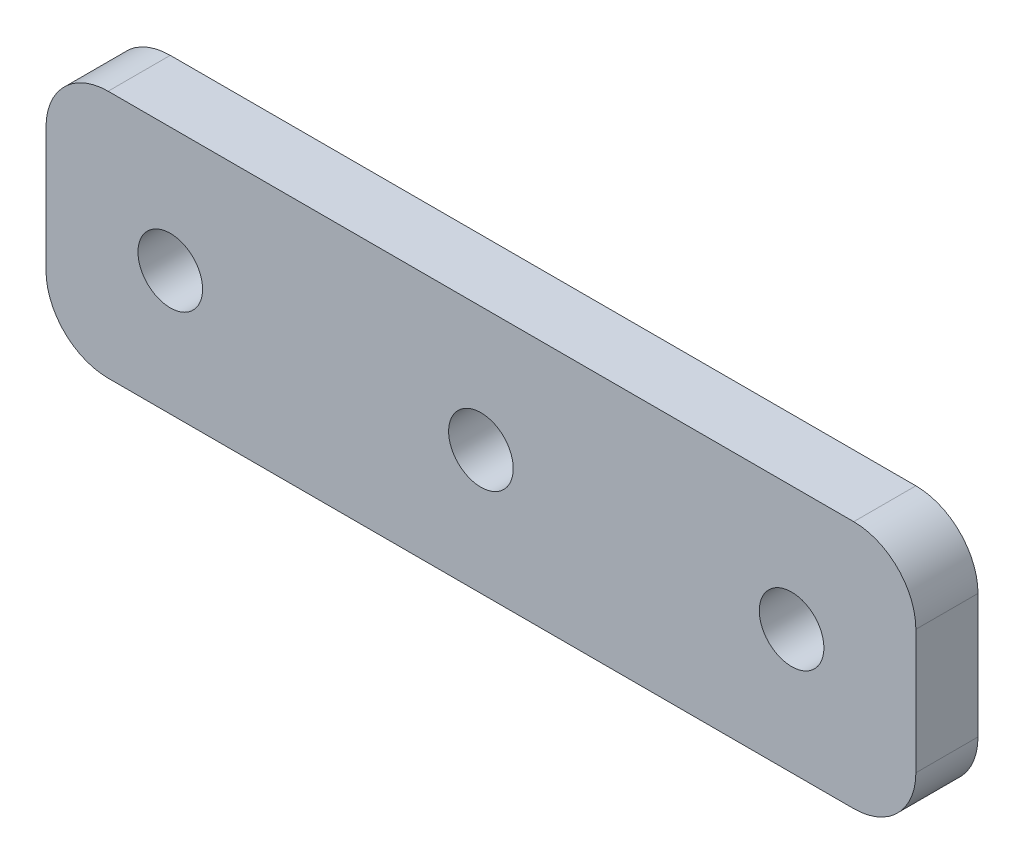
ISO-10303-21;
HEADER;
FILE_DESCRIPTION(('STEP AP214'),'2;1');
FILE_NAME('part.step','',(''),(''),'','','');
FILE_SCHEMA(('AUTOMOTIVE_DESIGN { 1 0 10303 214 1 1 1 1 }'));
ENDSEC;
DATA;
#1=APPLICATION_CONTEXT('core data for automotive mechanical design processes');
#2=APPLICATION_PROTOCOL_DEFINITION('international standard','automotive_design',2000,#1);
#3=PRODUCT_CONTEXT('',#1,'mechanical');
#4=PRODUCT('Part','Part','',(#3));
#5=PRODUCT_RELATED_PRODUCT_CATEGORY('part','',(#4));
#6=PRODUCT_DEFINITION_FORMATION('','',#4);
#7=PRODUCT_DEFINITION_CONTEXT('part definition',#1,'design');
#8=PRODUCT_DEFINITION('design','',#6,#7);
#9=PRODUCT_DEFINITION_SHAPE('','',#8);
#10=(LENGTH_UNIT() NAMED_UNIT(*) SI_UNIT(.MILLI.,.METRE.));
#11=(NAMED_UNIT(*) PLANE_ANGLE_UNIT() SI_UNIT($,.RADIAN.));
#12=(NAMED_UNIT(*) SI_UNIT($,.STERADIAN.) SOLID_ANGLE_UNIT());
#13=UNCERTAINTY_MEASURE_WITH_UNIT(LENGTH_MEASURE(1.E-05),#10,'distance_accuracy_value','');
#14=(GEOMETRIC_REPRESENTATION_CONTEXT(3) GLOBAL_UNCERTAINTY_ASSIGNED_CONTEXT((#13)) GLOBAL_UNIT_ASSIGNED_CONTEXT((#10,
#11,#12)) REPRESENTATION_CONTEXT('',''));
#15=CARTESIAN_POINT('',(0.,0.,0.));
#16=DIRECTION('',(0.,0.,1.));
#17=DIRECTION('',(1.,0.,0.));
#18=AXIS2_PLACEMENT_3D('',#15,#16,#17);
#19=CARTESIAN_POINT('',(0.,0.,5.));
#20=DIRECTION('',(0.,0.,1.));
#21=DIRECTION('',(1.,0.,0.));
#22=AXIS2_PLACEMENT_3D('',#19,#20,#21);
#23=PLANE('',#22);
#24=CARTESIAN_POINT('',(50.,0.,5.));
#25=DIRECTION('',(0.,0.,1.));
#26=DIRECTION('',(1.,0.,0.));
#27=AXIS2_PLACEMENT_3D('',#24,#25,#26);
#28=CIRCLE('',#27,2.6);
#29=CARTESIAN_POINT('',(52.6,0.,5.));
#30=VERTEX_POINT('',#29);
#31=EDGE_CURVE('E217',#30,#30,#28,.T.);
#32=ORIENTED_EDGE('',*,*,#31,.F.);
#33=EDGE_LOOP('',(#32));
#34=FACE_BOUND('',#33,.T.);
#35=DIRECTION('',(0.,-1.,0.));
#36=VECTOR('',#35,1.);
#37=CARTESIAN_POINT('',(-10.,-10.,5.));
#38=LINE('',#37,#36);
#39=CARTESIAN_POINT('',(-10.,5.,5.));
#40=VERTEX_POINT('',#39);
#41=CARTESIAN_POINT('',(-10.,-5.,5.));
#42=VERTEX_POINT('',#41);
#43=EDGE_CURVE('E156',#40,#42,#38,.T.);
#44=ORIENTED_EDGE('',*,*,#43,.T.);
#45=CARTESIAN_POINT('',(-5.,-5.,5.));
#46=DIRECTION('',(0.,0.,1.));
#47=DIRECTION('',(1.,0.,0.));
#48=AXIS2_PLACEMENT_3D('',#45,#46,#47);
#49=CIRCLE('',#48,5.);
#50=CARTESIAN_POINT('',(-5.,-10.,5.));
#51=VERTEX_POINT('',#50);
#52=EDGE_CURVE('E180',#42,#51,#49,.T.);
#53=ORIENTED_EDGE('',*,*,#52,.T.);
#54=DIRECTION('',(1.,0.,0.));
#55=VECTOR('',#54,1.);
#56=CARTESIAN_POINT('',(60.,-10.,5.));
#57=LINE('',#56,#55);
#58=CARTESIAN_POINT('',(55.,-10.,5.));
#59=VERTEX_POINT('',#58);
#60=EDGE_CURVE('E133',#51,#59,#57,.T.);
#61=ORIENTED_EDGE('',*,*,#60,.T.);
#62=CARTESIAN_POINT('',(55.,-5.,5.));
#63=DIRECTION('',(0.,0.,1.));
#64=DIRECTION('',(1.,0.,0.));
#65=AXIS2_PLACEMENT_3D('',#62,#63,#64);
#66=CIRCLE('',#65,5.);
#67=CARTESIAN_POINT('',(60.,-5.,5.));
#68=VERTEX_POINT('',#67);
#69=EDGE_CURVE('E172',#59,#68,#66,.T.);
#70=ORIENTED_EDGE('',*,*,#69,.T.);
#71=DIRECTION('',(0.,1.,0.));
#72=VECTOR('',#71,1.);
#73=CARTESIAN_POINT('',(60.,-10.,5.));
#74=LINE('',#73,#72);
#75=CARTESIAN_POINT('',(60.,5.,5.));
#76=VERTEX_POINT('',#75);
#77=EDGE_CURVE('E195',#68,#76,#74,.T.);
#78=ORIENTED_EDGE('',*,*,#77,.T.);
#79=CARTESIAN_POINT('',(55.,5.,5.));
#80=DIRECTION('',(0.,0.,1.));
#81=DIRECTION('',(1.,0.,0.));
#82=AXIS2_PLACEMENT_3D('',#79,#80,#81);
#83=CIRCLE('',#82,5.);
#84=CARTESIAN_POINT('',(55.,10.,5.));
#85=VERTEX_POINT('',#84);
#86=EDGE_CURVE('E68',#76,#85,#83,.T.);
#87=ORIENTED_EDGE('',*,*,#86,.T.);
#88=DIRECTION('',(-1.,0.,0.));
#89=VECTOR('',#88,1.);
#90=CARTESIAN_POINT('',(60.,10.,5.));
#91=LINE('',#90,#89);
#92=CARTESIAN_POINT('',(-5.,10.,5.));
#93=VERTEX_POINT('',#92);
#94=EDGE_CURVE('E158',#85,#93,#91,.T.);
#95=ORIENTED_EDGE('',*,*,#94,.T.);
#96=CARTESIAN_POINT('',(-5.,5.,5.));
#97=DIRECTION('',(0.,0.,1.));
#98=DIRECTION('',(1.,0.,0.));
#99=AXIS2_PLACEMENT_3D('',#96,#97,#98);
#100=CIRCLE('',#99,5.);
#101=EDGE_CURVE('E177',#93,#40,#100,.T.);
#102=ORIENTED_EDGE('',*,*,#101,.T.);
#103=EDGE_LOOP('',(#44,#53,#61,#70,#78,#87,#95,#102));
#104=FACE_BOUND('',#103,.T.);
#105=CARTESIAN_POINT('',(25.,0.,5.));
#106=DIRECTION('',(0.,0.,1.));
#107=DIRECTION('',(1.,0.,0.));
#108=AXIS2_PLACEMENT_3D('',#105,#106,#107);
#109=CIRCLE('',#108,2.6);
#110=CARTESIAN_POINT('',(27.6,0.,5.));
#111=VERTEX_POINT('',#110);
#112=EDGE_CURVE('E150',#111,#111,#109,.T.);
#113=ORIENTED_EDGE('',*,*,#112,.F.);
#114=EDGE_LOOP('',(#113));
#115=FACE_BOUND('',#114,.T.);
#116=CARTESIAN_POINT('',(0.,0.,5.));
#117=DIRECTION('',(0.,0.,1.));
#118=DIRECTION('',(1.,0.,0.));
#119=AXIS2_PLACEMENT_3D('',#116,#117,#118);
#120=CIRCLE('',#119,2.6);
#121=CARTESIAN_POINT('',(2.6,0.,5.));
#122=VERTEX_POINT('',#121);
#123=EDGE_CURVE('E225',#122,#122,#120,.T.);
#124=ORIENTED_EDGE('',*,*,#123,.F.);
#125=EDGE_LOOP('',(#124));
#126=FACE_BOUND('',#125,.T.);
#127=ADVANCED_FACE('F45',(#34,#104,#115,#126),#23,.T.);
#128=CARTESIAN_POINT('',(0.,0.,0.));
#129=DIRECTION('',(0.,0.,1.));
#130=DIRECTION('',(1.,0.,0.));
#131=AXIS2_PLACEMENT_3D('',#128,#129,#130);
#132=PLANE('',#131);
#133=DIRECTION('',(1.,0.,0.));
#134=VECTOR('',#133,1.);
#135=CARTESIAN_POINT('',(60.,-10.,0.));
#136=LINE('',#135,#134);
#137=CARTESIAN_POINT('',(-5.,-10.,0.));
#138=VERTEX_POINT('',#137);
#139=CARTESIAN_POINT('',(55.,-10.,0.));
#140=VERTEX_POINT('',#139);
#141=EDGE_CURVE('E130',#138,#140,#136,.T.);
#142=ORIENTED_EDGE('',*,*,#141,.F.);
#143=CARTESIAN_POINT('',(-5.,-5.,0.));
#144=DIRECTION('',(0.,0.,1.));
#145=DIRECTION('',(1.,0.,0.));
#146=AXIS2_PLACEMENT_3D('',#143,#144,#145);
#147=CIRCLE('',#146,5.);
#148=CARTESIAN_POINT('',(-10.,-5.,0.));
#149=VERTEX_POINT('',#148);
#150=EDGE_CURVE('E112',#138,#149,#147,.F.);
#151=ORIENTED_EDGE('',*,*,#150,.T.);
#152=DIRECTION('',(0.,-1.,0.));
#153=VECTOR('',#152,1.);
#154=CARTESIAN_POINT('',(-10.,-10.,0.));
#155=LINE('',#154,#153);
#156=CARTESIAN_POINT('',(-10.,5.,0.));
#157=VERTEX_POINT('',#156);
#158=EDGE_CURVE('E143',#157,#149,#155,.T.);
#159=ORIENTED_EDGE('',*,*,#158,.F.);
#160=CARTESIAN_POINT('',(-5.,5.,0.));
#161=DIRECTION('',(0.,0.,1.));
#162=DIRECTION('',(1.,0.,0.));
#163=AXIS2_PLACEMENT_3D('',#160,#161,#162);
#164=CIRCLE('',#163,5.);
#165=CARTESIAN_POINT('',(-5.,10.,0.));
#166=VERTEX_POINT('',#165);
#167=EDGE_CURVE('E124',#157,#166,#164,.F.);
#168=ORIENTED_EDGE('',*,*,#167,.T.);
#169=DIRECTION('',(-1.,0.,0.));
#170=VECTOR('',#169,1.);
#171=CARTESIAN_POINT('',(60.,10.,0.));
#172=LINE('',#171,#170);
#173=CARTESIAN_POINT('',(55.,10.,0.));
#174=VERTEX_POINT('',#173);
#175=EDGE_CURVE('E148',#174,#166,#172,.T.);
#176=ORIENTED_EDGE('',*,*,#175,.F.);
#177=CARTESIAN_POINT('',(55.,5.,0.));
#178=DIRECTION('',(0.,0.,1.));
#179=DIRECTION('',(1.,0.,0.));
#180=AXIS2_PLACEMENT_3D('',#177,#178,#179);
#181=CIRCLE('',#180,5.);
#182=CARTESIAN_POINT('',(60.,5.,0.));
#183=VERTEX_POINT('',#182);
#184=EDGE_CURVE('E162',#174,#183,#181,.F.);
#185=ORIENTED_EDGE('',*,*,#184,.T.);
#186=DIRECTION('',(0.,1.,0.));
#187=VECTOR('',#186,1.);
#188=CARTESIAN_POINT('',(60.,-10.,0.));
#189=LINE('',#188,#187);
#190=CARTESIAN_POINT('',(60.,-5.,0.));
#191=VERTEX_POINT('',#190);
#192=EDGE_CURVE('E142',#191,#183,#189,.T.);
#193=ORIENTED_EDGE('',*,*,#192,.F.);
#194=CARTESIAN_POINT('',(55.,-5.,0.));
#195=DIRECTION('',(0.,0.,1.));
#196=DIRECTION('',(1.,0.,0.));
#197=AXIS2_PLACEMENT_3D('',#194,#195,#196);
#198=CIRCLE('',#197,5.);
#199=EDGE_CURVE('E135',#191,#140,#198,.F.);
#200=ORIENTED_EDGE('',*,*,#199,.T.);
#201=EDGE_LOOP('',(#142,#151,#159,#168,#176,#185,#193,#200));
#202=FACE_BOUND('',#201,.T.);
#203=CARTESIAN_POINT('',(25.,0.,0.));
#204=DIRECTION('',(0.,0.,1.));
#205=DIRECTION('',(1.,0.,0.));
#206=AXIS2_PLACEMENT_3D('',#203,#204,#205);
#207=CIRCLE('',#206,2.6);
#208=CARTESIAN_POINT('',(27.6,0.,0.));
#209=VERTEX_POINT('',#208);
#210=EDGE_CURVE('E213',#209,#209,#207,.T.);
#211=ORIENTED_EDGE('',*,*,#210,.T.);
#212=EDGE_LOOP('',(#211));
#213=FACE_BOUND('',#212,.T.);
#214=CARTESIAN_POINT('',(50.,0.,0.));
#215=DIRECTION('',(0.,0.,1.));
#216=DIRECTION('',(1.,0.,0.));
#217=AXIS2_PLACEMENT_3D('',#214,#215,#216);
#218=CIRCLE('',#217,2.6);
#219=CARTESIAN_POINT('',(52.6,0.,0.));
#220=VERTEX_POINT('',#219);
#221=EDGE_CURVE('E221',#220,#220,#218,.T.);
#222=ORIENTED_EDGE('',*,*,#221,.T.);
#223=EDGE_LOOP('',(#222));
#224=FACE_BOUND('',#223,.T.);
#225=CARTESIAN_POINT('',(0.,0.,0.));
#226=DIRECTION('',(0.,0.,1.));
#227=DIRECTION('',(1.,0.,0.));
#228=AXIS2_PLACEMENT_3D('',#225,#226,#227);
#229=CIRCLE('',#228,2.6);
#230=CARTESIAN_POINT('',(2.6,0.,0.));
#231=VERTEX_POINT('',#230);
#232=EDGE_CURVE('E229',#231,#231,#229,.T.);
#233=ORIENTED_EDGE('',*,*,#232,.T.);
#234=EDGE_LOOP('',(#233));
#235=FACE_BOUND('',#234,.T.);
#236=ADVANCED_FACE('F138',(#202,#213,#224,#235),#132,.F.);
#237=CARTESIAN_POINT('',(-10.,-10.,5.));
#238=DIRECTION('',(1.,0.,0.));
#239=DIRECTION('',(0.,0.,-1.));
#240=AXIS2_PLACEMENT_3D('',#237,#238,#239);
#241=PLANE('',#240);
#242=ORIENTED_EDGE('',*,*,#158,.T.);
#243=DIRECTION('',(0.,0.,-1.));
#244=VECTOR('',#243,1.);
#245=CARTESIAN_POINT('',(-10.,-5.,5.));
#246=LINE('',#245,#244);
#247=EDGE_CURVE('E117',#149,#42,#246,.F.);
#248=ORIENTED_EDGE('',*,*,#247,.T.);
#249=ORIENTED_EDGE('',*,*,#43,.F.);
#250=DIRECTION('',(0.,0.,-1.));
#251=VECTOR('',#250,1.);
#252=CARTESIAN_POINT('',(-10.,5.,5.));
#253=LINE('',#252,#251);
#254=EDGE_CURVE('E123',#40,#157,#253,.T.);
#255=ORIENTED_EDGE('',*,*,#254,.T.);
#256=EDGE_LOOP('',(#242,#248,#249,#255));
#257=FACE_BOUND('',#256,.T.);
#258=ADVANCED_FACE('F247',(#257),#241,.F.);
#259=CARTESIAN_POINT('',(60.,-10.,5.));
#260=DIRECTION('',(0.,1.,0.));
#261=DIRECTION('',(0.,0.,1.));
#262=AXIS2_PLACEMENT_3D('',#259,#260,#261);
#263=PLANE('',#262);
#264=ORIENTED_EDGE('',*,*,#60,.F.);
#265=DIRECTION('',(0.,0.,-1.));
#266=VECTOR('',#265,1.);
#267=CARTESIAN_POINT('',(-5.,-10.,5.));
#268=LINE('',#267,#266);
#269=EDGE_CURVE('E116',#51,#138,#268,.T.);
#270=ORIENTED_EDGE('',*,*,#269,.T.);
#271=ORIENTED_EDGE('',*,*,#141,.T.);
#272=DIRECTION('',(0.,0.,-1.));
#273=VECTOR('',#272,1.);
#274=CARTESIAN_POINT('',(55.,-10.,5.));
#275=LINE('',#274,#273);
#276=EDGE_CURVE('E136',#140,#59,#275,.F.);
#277=ORIENTED_EDGE('',*,*,#276,.T.);
#278=EDGE_LOOP('',(#264,#270,#271,#277));
#279=FACE_BOUND('',#278,.T.);
#280=ADVANCED_FACE('F129',(#279),#263,.F.);
#281=CARTESIAN_POINT('',(60.,-10.,5.));
#282=DIRECTION('',(-1.,0.,0.));
#283=DIRECTION('',(0.,0.,1.));
#284=AXIS2_PLACEMENT_3D('',#281,#282,#283);
#285=PLANE('',#284);
#286=ORIENTED_EDGE('',*,*,#192,.T.);
#287=DIRECTION('',(0.,0.,-1.));
#288=VECTOR('',#287,1.);
#289=CARTESIAN_POINT('',(60.,5.,5.));
#290=LINE('',#289,#288);
#291=EDGE_CURVE('E11',#183,#76,#290,.F.);
#292=ORIENTED_EDGE('',*,*,#291,.T.);
#293=ORIENTED_EDGE('',*,*,#77,.F.);
#294=DIRECTION('',(0.,0.,-1.));
#295=VECTOR('',#294,1.);
#296=CARTESIAN_POINT('',(60.,-5.,5.));
#297=LINE('',#296,#295);
#298=EDGE_CURVE('E54',#68,#191,#297,.T.);
#299=ORIENTED_EDGE('',*,*,#298,.T.);
#300=EDGE_LOOP('',(#286,#292,#293,#299));
#301=FACE_BOUND('',#300,.T.);
#302=ADVANCED_FACE('F193',(#301),#285,.F.);
#303=CARTESIAN_POINT('',(60.,10.,5.));
#304=DIRECTION('',(0.,-1.,0.));
#305=DIRECTION('',(0.,0.,-1.));
#306=AXIS2_PLACEMENT_3D('',#303,#304,#305);
#307=PLANE('',#306);
#308=ORIENTED_EDGE('',*,*,#175,.T.);
#309=DIRECTION('',(0.,0.,-1.));
#310=VECTOR('',#309,1.);
#311=CARTESIAN_POINT('',(-5.,10.,5.));
#312=LINE('',#311,#310);
#313=EDGE_CURVE('E61',#166,#93,#312,.F.);
#314=ORIENTED_EDGE('',*,*,#313,.T.);
#315=ORIENTED_EDGE('',*,*,#94,.F.);
#316=DIRECTION('',(0.,0.,-1.));
#317=VECTOR('',#316,1.);
#318=CARTESIAN_POINT('',(55.,10.,5.));
#319=LINE('',#318,#317);
#320=EDGE_CURVE('E183',#85,#174,#319,.T.);
#321=ORIENTED_EDGE('',*,*,#320,.T.);
#322=EDGE_LOOP('',(#308,#314,#315,#321));
#323=FACE_BOUND('',#322,.T.);
#324=ADVANCED_FACE('F202',(#323),#307,.F.);
#325=CARTESIAN_POINT('',(25.,0.,5.));
#326=DIRECTION('',(0.,0.,-1.));
#327=DIRECTION('',(-1.,0.,0.));
#328=AXIS2_PLACEMENT_3D('',#325,#326,#327);
#329=CYLINDRICAL_SURFACE('',#328,2.6);
#330=ORIENTED_EDGE('',*,*,#112,.T.);
#331=EDGE_LOOP('',(#330));
#332=FACE_BOUND('',#331,.T.);
#333=ORIENTED_EDGE('',*,*,#210,.F.);
#334=EDGE_LOOP('',(#333));
#335=FACE_BOUND('',#334,.T.);
#336=ADVANCED_FACE('F251',(#332,#335),#329,.F.);
#337=CARTESIAN_POINT('',(50.,0.,5.));
#338=DIRECTION('',(0.,0.,-1.));
#339=DIRECTION('',(-1.,0.,0.));
#340=AXIS2_PLACEMENT_3D('',#337,#338,#339);
#341=CYLINDRICAL_SURFACE('',#340,2.6);
#342=ORIENTED_EDGE('',*,*,#31,.T.);
#343=EDGE_LOOP('',(#342));
#344=FACE_BOUND('',#343,.T.);
#345=ORIENTED_EDGE('',*,*,#221,.F.);
#346=EDGE_LOOP('',(#345));
#347=FACE_BOUND('',#346,.T.);
#348=ADVANCED_FACE('F281',(#344,#347),#341,.F.);
#349=CARTESIAN_POINT('',(0.,0.,5.));
#350=DIRECTION('',(0.,0.,-1.));
#351=DIRECTION('',(-1.,0.,0.));
#352=AXIS2_PLACEMENT_3D('',#349,#350,#351);
#353=CYLINDRICAL_SURFACE('',#352,2.6);
#354=ORIENTED_EDGE('',*,*,#123,.T.);
#355=EDGE_LOOP('',(#354));
#356=FACE_BOUND('',#355,.T.);
#357=ORIENTED_EDGE('',*,*,#232,.F.);
#358=EDGE_LOOP('',(#357));
#359=FACE_BOUND('',#358,.T.);
#360=ADVANCED_FACE('F237',(#356,#359),#353,.F.);
#361=CARTESIAN_POINT('',(-5.,-5.,5.));
#362=DIRECTION('',(0.,0.,-1.));
#363=DIRECTION('',(-1.,0.,0.));
#364=AXIS2_PLACEMENT_3D('',#361,#362,#363);
#365=CYLINDRICAL_SURFACE('',#364,5.);
#366=ORIENTED_EDGE('',*,*,#52,.F.);
#367=ORIENTED_EDGE('',*,*,#247,.F.);
#368=ORIENTED_EDGE('',*,*,#150,.F.);
#369=ORIENTED_EDGE('',*,*,#269,.F.);
#370=EDGE_LOOP('',(#366,#367,#368,#369));
#371=FACE_BOUND('',#370,.T.);
#372=ADVANCED_FACE('F115',(#371),#365,.T.);
#373=CARTESIAN_POINT('',(-5.,5.,5.));
#374=DIRECTION('',(0.,0.,-1.));
#375=DIRECTION('',(-1.,0.,0.));
#376=AXIS2_PLACEMENT_3D('',#373,#374,#375);
#377=CYLINDRICAL_SURFACE('',#376,5.);
#378=ORIENTED_EDGE('',*,*,#101,.F.);
#379=ORIENTED_EDGE('',*,*,#313,.F.);
#380=ORIENTED_EDGE('',*,*,#167,.F.);
#381=ORIENTED_EDGE('',*,*,#254,.F.);
#382=EDGE_LOOP('',(#378,#379,#380,#381));
#383=FACE_BOUND('',#382,.T.);
#384=ADVANCED_FACE('F265',(#383),#377,.T.);
#385=CARTESIAN_POINT('',(55.,5.,5.));
#386=DIRECTION('',(0.,0.,-1.));
#387=DIRECTION('',(-1.,0.,0.));
#388=AXIS2_PLACEMENT_3D('',#385,#386,#387);
#389=CYLINDRICAL_SURFACE('',#388,5.);
#390=ORIENTED_EDGE('',*,*,#86,.F.);
#391=ORIENTED_EDGE('',*,*,#291,.F.);
#392=ORIENTED_EDGE('',*,*,#184,.F.);
#393=ORIENTED_EDGE('',*,*,#320,.F.);
#394=EDGE_LOOP('',(#390,#391,#392,#393));
#395=FACE_BOUND('',#394,.T.);
#396=ADVANCED_FACE('F201',(#395),#389,.T.);
#397=CARTESIAN_POINT('',(55.,-5.,5.));
#398=DIRECTION('',(0.,0.,-1.));
#399=DIRECTION('',(-1.,0.,0.));
#400=AXIS2_PLACEMENT_3D('',#397,#398,#399);
#401=CYLINDRICAL_SURFACE('',#400,5.);
#402=ORIENTED_EDGE('',*,*,#69,.F.);
#403=ORIENTED_EDGE('',*,*,#276,.F.);
#404=ORIENTED_EDGE('',*,*,#199,.F.);
#405=ORIENTED_EDGE('',*,*,#298,.F.);
#406=EDGE_LOOP('',(#402,#403,#404,#405));
#407=FACE_BOUND('',#406,.T.);
#408=ADVANCED_FACE('F47',(#407),#401,.T.);
#409=CLOSED_SHELL('',(#127,#236,#258,#280,#302,#324,#336,#348,#360,#372,#384,#396,#408));
#410=MANIFOLD_SOLID_BREP('B2',#409);
#411=ADVANCED_BREP_SHAPE_REPRESENTATION('',(#18,#410),#14);
#412=SHAPE_DEFINITION_REPRESENTATION(#9,#411);
ENDSEC;
END-ISO-10303-21;
